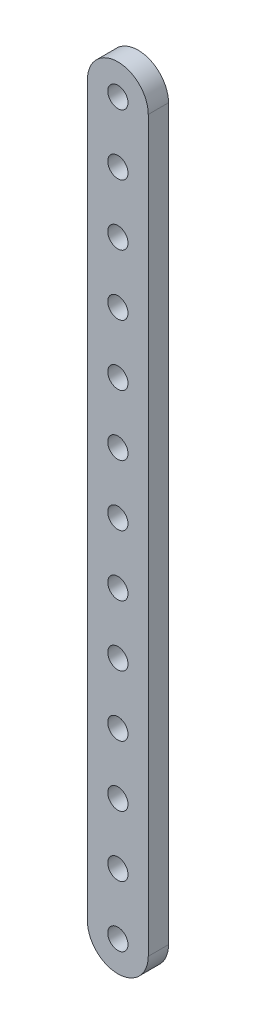
ISO-10303-21;
HEADER;
FILE_DESCRIPTION(('STEP AP214'),'2;1');
FILE_NAME('part.step','',(''),(''),'','','');
FILE_SCHEMA(('AUTOMOTIVE_DESIGN { 1 0 10303 214 1 1 1 1 }'));
ENDSEC;
DATA;
#1=APPLICATION_CONTEXT('core data for automotive mechanical design processes');
#2=APPLICATION_PROTOCOL_DEFINITION('international standard','automotive_design',2000,#1);
#3=PRODUCT_CONTEXT('',#1,'mechanical');
#4=PRODUCT('Part','Part','',(#3));
#5=PRODUCT_RELATED_PRODUCT_CATEGORY('part','',(#4));
#6=PRODUCT_DEFINITION_FORMATION('','',#4);
#7=PRODUCT_DEFINITION_CONTEXT('part definition',#1,'design');
#8=PRODUCT_DEFINITION('design','',#6,#7);
#9=PRODUCT_DEFINITION_SHAPE('','',#8);
#10=(LENGTH_UNIT() NAMED_UNIT(*) SI_UNIT(.MILLI.,.METRE.));
#11=(NAMED_UNIT(*) PLANE_ANGLE_UNIT() SI_UNIT($,.RADIAN.));
#12=(NAMED_UNIT(*) SI_UNIT($,.STERADIAN.) SOLID_ANGLE_UNIT());
#13=UNCERTAINTY_MEASURE_WITH_UNIT(LENGTH_MEASURE(1.E-05),#10,'distance_accuracy_value','');
#14=(GEOMETRIC_REPRESENTATION_CONTEXT(3) GLOBAL_UNCERTAINTY_ASSIGNED_CONTEXT((#13)) GLOBAL_UNIT_ASSIGNED_CONTEXT((#10,
#11,#12)) REPRESENTATION_CONTEXT('',''));
#15=CARTESIAN_POINT('',(0.,0.,0.));
#16=DIRECTION('',(0.,0.,1.));
#17=DIRECTION('',(1.,0.,0.));
#18=AXIS2_PLACEMENT_3D('',#15,#16,#17);
#19=CARTESIAN_POINT('',(208.7507761496,80.428489513,3.));
#20=DIRECTION('',(0.,0.,1.));
#21=DIRECTION('',(1.,0.,0.));
#22=AXIS2_PLACEMENT_3D('',#19,#20,#21);
#23=PLANE('',#22);
#24=CARTESIAN_POINT('',(208.7507761496,98.428489513,3.));
#25=DIRECTION('',(0.,0.,1.));
#26=DIRECTION('',(1.,0.,0.));
#27=AXIS2_PLACEMENT_3D('',#24,#25,#26);
#28=CIRCLE('',#27,1.5);
#29=CARTESIAN_POINT('',(210.2507761496,98.428489513,3.));
#30=VERTEX_POINT('',#29);
#31=EDGE_CURVE('E175',#30,#30,#28,.T.);
#32=ORIENTED_EDGE('',*,*,#31,.F.);
#33=EDGE_LOOP('',(#32));
#34=FACE_BOUND('',#33,.T.);
#35=CARTESIAN_POINT('',(208.7507761496,80.428489513,3.));
#36=DIRECTION('',(0.,0.,1.));
#37=DIRECTION('',(1.,0.,0.));
#38=AXIS2_PLACEMENT_3D('',#35,#36,#37);
#39=CIRCLE('',#38,1.5);
#40=CARTESIAN_POINT('',(210.2507761496,80.428489513,3.));
#41=VERTEX_POINT('',#40);
#42=EDGE_CURVE('E163',#41,#41,#39,.T.);
#43=ORIENTED_EDGE('',*,*,#42,.F.);
#44=EDGE_LOOP('',(#43));
#45=FACE_BOUND('',#44,.T.);
#46=CARTESIAN_POINT('',(208.7507761496,125.428489513,3.));
#47=DIRECTION('',(0.,0.,1.));
#48=DIRECTION('',(1.,0.,0.));
#49=AXIS2_PLACEMENT_3D('',#46,#47,#48);
#50=CIRCLE('',#49,1.5);
#51=CARTESIAN_POINT('',(210.2507761496,125.428489513,3.));
#52=VERTEX_POINT('',#51);
#53=EDGE_CURVE('E151',#52,#52,#50,.T.);
#54=ORIENTED_EDGE('',*,*,#53,.F.);
#55=EDGE_LOOP('',(#54));
#56=FACE_BOUND('',#55,.T.);
#57=CARTESIAN_POINT('',(208.7507761496,143.428489513,3.));
#58=DIRECTION('',(0.,0.,1.));
#59=DIRECTION('',(1.,0.,0.));
#60=AXIS2_PLACEMENT_3D('',#57,#58,#59);
#61=CIRCLE('',#60,1.5);
#62=CARTESIAN_POINT('',(210.2507761496,143.428489513,3.));
#63=VERTEX_POINT('',#62);
#64=EDGE_CURVE('E139',#63,#63,#61,.T.);
#65=ORIENTED_EDGE('',*,*,#64,.F.);
#66=EDGE_LOOP('',(#65));
#67=FACE_BOUND('',#66,.T.);
#68=CARTESIAN_POINT('',(208.7507761496,161.428489513,3.));
#69=DIRECTION('',(0.,0.,1.));
#70=DIRECTION('',(1.,0.,0.));
#71=AXIS2_PLACEMENT_3D('',#68,#69,#70);
#72=CIRCLE('',#71,1.5);
#73=CARTESIAN_POINT('',(210.2507761496,161.428489513,3.));
#74=VERTEX_POINT('',#73);
#75=EDGE_CURVE('E127',#74,#74,#72,.T.);
#76=ORIENTED_EDGE('',*,*,#75,.F.);
#77=EDGE_LOOP('',(#76));
#78=FACE_BOUND('',#77,.T.);
#79=CARTESIAN_POINT('',(208.7507761496,188.428489513,3.));
#80=DIRECTION('',(0.,0.,1.));
#81=DIRECTION('',(1.,0.,0.));
#82=AXIS2_PLACEMENT_3D('',#79,#80,#81);
#83=CIRCLE('',#82,1.5);
#84=CARTESIAN_POINT('',(210.2507761496,188.428489513,3.));
#85=VERTEX_POINT('',#84);
#86=EDGE_CURVE('E115',#85,#85,#83,.T.);
#87=ORIENTED_EDGE('',*,*,#86,.F.);
#88=EDGE_LOOP('',(#87));
#89=FACE_BOUND('',#88,.T.);
#90=CARTESIAN_POINT('',(208.7507761496,80.428489513,3.));
#91=DIRECTION('',(0.,0.,1.));
#92=DIRECTION('',(1.,0.,0.));
#93=AXIS2_PLACEMENT_3D('',#90,#91,#92);
#94=CIRCLE('',#93,4.5);
#95=CARTESIAN_POINT('',(204.2507761496,80.428489513,3.));
#96=VERTEX_POINT('',#95);
#97=CARTESIAN_POINT('',(213.2507761496,80.428489513,3.));
#98=VERTEX_POINT('',#97);
#99=EDGE_CURVE('E85',#96,#98,#94,.T.);
#100=ORIENTED_EDGE('',*,*,#99,.T.);
#101=DIRECTION('',(0.,1.,0.));
#102=VECTOR('',#101,1.);
#103=CARTESIAN_POINT('',(213.2507761496,80.428489513,3.));
#104=LINE('',#103,#102);
#105=CARTESIAN_POINT('',(213.2507761496,188.428489513,3.));
#106=VERTEX_POINT('',#105);
#107=EDGE_CURVE('E80',#98,#106,#104,.T.);
#108=ORIENTED_EDGE('',*,*,#107,.T.);
#109=CARTESIAN_POINT('',(208.7507761496,188.428489513,3.));
#110=DIRECTION('',(0.,0.,1.));
#111=DIRECTION('',(1.,0.,0.));
#112=AXIS2_PLACEMENT_3D('',#109,#110,#111);
#113=CIRCLE('',#112,4.5);
#114=CARTESIAN_POINT('',(204.2507761496,188.428489513,3.));
#115=VERTEX_POINT('',#114);
#116=EDGE_CURVE('E83',#106,#115,#113,.T.);
#117=ORIENTED_EDGE('',*,*,#116,.T.);
#118=DIRECTION('',(0.,-1.,0.));
#119=VECTOR('',#118,1.);
#120=CARTESIAN_POINT('',(204.2507761496,188.428489513,3.));
#121=LINE('',#120,#119);
#122=EDGE_CURVE('E50',#115,#96,#121,.T.);
#123=ORIENTED_EDGE('',*,*,#122,.T.);
#124=EDGE_LOOP('',(#100,#108,#117,#123));
#125=FACE_BOUND('',#124,.T.);
#126=CARTESIAN_POINT('',(208.7507761496,179.428489513,3.));
#127=DIRECTION('',(0.,0.,1.));
#128=DIRECTION('',(1.,0.,0.));
#129=AXIS2_PLACEMENT_3D('',#126,#127,#128);
#130=CIRCLE('',#129,1.5);
#131=CARTESIAN_POINT('',(210.2507761496,179.428489513,3.));
#132=VERTEX_POINT('',#131);
#133=EDGE_CURVE('E100',#132,#132,#130,.T.);
#134=ORIENTED_EDGE('',*,*,#133,.F.);
#135=EDGE_LOOP('',(#134));
#136=FACE_BOUND('',#135,.T.);
#137=CARTESIAN_POINT('',(208.7507761496,152.428489513,3.));
#138=DIRECTION('',(0.,0.,1.));
#139=DIRECTION('',(1.,0.,0.));
#140=AXIS2_PLACEMENT_3D('',#137,#138,#139);
#141=CIRCLE('',#140,1.5);
#142=CARTESIAN_POINT('',(210.2507761496,152.428489513,3.));
#143=VERTEX_POINT('',#142);
#144=EDGE_CURVE('E121',#143,#143,#141,.T.);
#145=ORIENTED_EDGE('',*,*,#144,.F.);
#146=EDGE_LOOP('',(#145));
#147=FACE_BOUND('',#146,.T.);
#148=CARTESIAN_POINT('',(208.7507761496,170.428489513,3.));
#149=DIRECTION('',(0.,0.,1.));
#150=DIRECTION('',(1.,0.,0.));
#151=AXIS2_PLACEMENT_3D('',#148,#149,#150);
#152=CIRCLE('',#151,1.5);
#153=CARTESIAN_POINT('',(210.2507761496,170.428489513,3.));
#154=VERTEX_POINT('',#153);
#155=EDGE_CURVE('E133',#154,#154,#152,.T.);
#156=ORIENTED_EDGE('',*,*,#155,.F.);
#157=EDGE_LOOP('',(#156));
#158=FACE_BOUND('',#157,.T.);
#159=CARTESIAN_POINT('',(208.7507761496,116.428489513,3.));
#160=DIRECTION('',(0.,0.,1.));
#161=DIRECTION('',(1.,0.,0.));
#162=AXIS2_PLACEMENT_3D('',#159,#160,#161);
#163=CIRCLE('',#162,1.5);
#164=CARTESIAN_POINT('',(210.2507761496,116.428489513,3.));
#165=VERTEX_POINT('',#164);
#166=EDGE_CURVE('E145',#165,#165,#163,.T.);
#167=ORIENTED_EDGE('',*,*,#166,.F.);
#168=EDGE_LOOP('',(#167));
#169=FACE_BOUND('',#168,.T.);
#170=CARTESIAN_POINT('',(208.7507761496,134.428489513,3.));
#171=DIRECTION('',(0.,0.,1.));
#172=DIRECTION('',(1.,0.,0.));
#173=AXIS2_PLACEMENT_3D('',#170,#171,#172);
#174=CIRCLE('',#173,1.5);
#175=CARTESIAN_POINT('',(210.2507761496,134.428489513,3.));
#176=VERTEX_POINT('',#175);
#177=EDGE_CURVE('E157',#176,#176,#174,.T.);
#178=ORIENTED_EDGE('',*,*,#177,.F.);
#179=EDGE_LOOP('',(#178));
#180=FACE_BOUND('',#179,.T.);
#181=CARTESIAN_POINT('',(208.7507761496,89.428489513,3.));
#182=DIRECTION('',(0.,0.,1.));
#183=DIRECTION('',(1.,0.,0.));
#184=AXIS2_PLACEMENT_3D('',#181,#182,#183);
#185=CIRCLE('',#184,1.5);
#186=CARTESIAN_POINT('',(210.2507761496,89.428489513,3.));
#187=VERTEX_POINT('',#186);
#188=EDGE_CURVE('E169',#187,#187,#185,.T.);
#189=ORIENTED_EDGE('',*,*,#188,.F.);
#190=EDGE_LOOP('',(#189));
#191=FACE_BOUND('',#190,.T.);
#192=CARTESIAN_POINT('',(208.7507761496,107.428489513,3.));
#193=DIRECTION('',(0.,0.,1.));
#194=DIRECTION('',(1.,0.,0.));
#195=AXIS2_PLACEMENT_3D('',#192,#193,#194);
#196=CIRCLE('',#195,1.5);
#197=CARTESIAN_POINT('',(210.2507761496,107.428489513,3.));
#198=VERTEX_POINT('',#197);
#199=EDGE_CURVE('E181',#198,#198,#196,.T.);
#200=ORIENTED_EDGE('',*,*,#199,.F.);
#201=EDGE_LOOP('',(#200));
#202=FACE_BOUND('',#201,.T.);
#203=ADVANCED_FACE('F33',(#34,#45,#56,#67,#78,#89,#125,#136,#147,#158,#169,#180,#191,#202),#23,.T.);
#204=CARTESIAN_POINT('',(208.7507761496,80.428489513,0.));
#205=DIRECTION('',(0.,0.,1.));
#206=DIRECTION('',(1.,0.,0.));
#207=AXIS2_PLACEMENT_3D('',#204,#205,#206);
#208=PLANE('',#207);
#209=CARTESIAN_POINT('',(208.7507761496,98.428489513,0.));
#210=DIRECTION('',(0.,0.,1.));
#211=DIRECTION('',(1.,0.,0.));
#212=AXIS2_PLACEMENT_3D('',#209,#210,#211);
#213=CIRCLE('',#212,1.5);
#214=CARTESIAN_POINT('',(210.2507761496,98.428489513,0.));
#215=VERTEX_POINT('',#214);
#216=EDGE_CURVE('E178',#215,#215,#213,.T.);
#217=ORIENTED_EDGE('',*,*,#216,.T.);
#218=EDGE_LOOP('',(#217));
#219=FACE_BOUND('',#218,.T.);
#220=CARTESIAN_POINT('',(208.7507761496,80.428489513,0.));
#221=DIRECTION('',(0.,0.,1.));
#222=DIRECTION('',(1.,0.,0.));
#223=AXIS2_PLACEMENT_3D('',#220,#221,#222);
#224=CIRCLE('',#223,1.5);
#225=CARTESIAN_POINT('',(210.2507761496,80.428489513,0.));
#226=VERTEX_POINT('',#225);
#227=EDGE_CURVE('E166',#226,#226,#224,.T.);
#228=ORIENTED_EDGE('',*,*,#227,.T.);
#229=EDGE_LOOP('',(#228));
#230=FACE_BOUND('',#229,.T.);
#231=CARTESIAN_POINT('',(208.7507761496,125.428489513,0.));
#232=DIRECTION('',(0.,0.,1.));
#233=DIRECTION('',(1.,0.,0.));
#234=AXIS2_PLACEMENT_3D('',#231,#232,#233);
#235=CIRCLE('',#234,1.5);
#236=CARTESIAN_POINT('',(210.2507761496,125.428489513,0.));
#237=VERTEX_POINT('',#236);
#238=EDGE_CURVE('E154',#237,#237,#235,.T.);
#239=ORIENTED_EDGE('',*,*,#238,.T.);
#240=EDGE_LOOP('',(#239));
#241=FACE_BOUND('',#240,.T.);
#242=CARTESIAN_POINT('',(208.7507761496,143.428489513,0.));
#243=DIRECTION('',(0.,0.,1.));
#244=DIRECTION('',(1.,0.,0.));
#245=AXIS2_PLACEMENT_3D('',#242,#243,#244);
#246=CIRCLE('',#245,1.5);
#247=CARTESIAN_POINT('',(210.2507761496,143.428489513,0.));
#248=VERTEX_POINT('',#247);
#249=EDGE_CURVE('E142',#248,#248,#246,.T.);
#250=ORIENTED_EDGE('',*,*,#249,.T.);
#251=EDGE_LOOP('',(#250));
#252=FACE_BOUND('',#251,.T.);
#253=CARTESIAN_POINT('',(208.7507761496,161.428489513,0.));
#254=DIRECTION('',(0.,0.,1.));
#255=DIRECTION('',(1.,0.,0.));
#256=AXIS2_PLACEMENT_3D('',#253,#254,#255);
#257=CIRCLE('',#256,1.5);
#258=CARTESIAN_POINT('',(210.2507761496,161.428489513,0.));
#259=VERTEX_POINT('',#258);
#260=EDGE_CURVE('E130',#259,#259,#257,.T.);
#261=ORIENTED_EDGE('',*,*,#260,.T.);
#262=EDGE_LOOP('',(#261));
#263=FACE_BOUND('',#262,.T.);
#264=CARTESIAN_POINT('',(208.7507761496,188.428489513,0.));
#265=DIRECTION('',(0.,0.,1.));
#266=DIRECTION('',(1.,0.,0.));
#267=AXIS2_PLACEMENT_3D('',#264,#265,#266);
#268=CIRCLE('',#267,1.5);
#269=CARTESIAN_POINT('',(210.2507761496,188.428489513,0.));
#270=VERTEX_POINT('',#269);
#271=EDGE_CURVE('E118',#270,#270,#268,.T.);
#272=ORIENTED_EDGE('',*,*,#271,.T.);
#273=EDGE_LOOP('',(#272));
#274=FACE_BOUND('',#273,.T.);
#275=CARTESIAN_POINT('',(208.7507761496,80.428489513,0.));
#276=DIRECTION('',(0.,0.,1.));
#277=DIRECTION('',(1.,0.,0.));
#278=AXIS2_PLACEMENT_3D('',#275,#276,#277);
#279=CIRCLE('',#278,4.5);
#280=CARTESIAN_POINT('',(204.2507761496,80.428489513,0.));
#281=VERTEX_POINT('',#280);
#282=CARTESIAN_POINT('',(213.2507761496,80.428489513,0.));
#283=VERTEX_POINT('',#282);
#284=EDGE_CURVE('E97',#281,#283,#279,.T.);
#285=ORIENTED_EDGE('',*,*,#284,.F.);
#286=DIRECTION('',(0.,-1.,0.));
#287=VECTOR('',#286,1.);
#288=CARTESIAN_POINT('',(204.2507761496,188.428489513,0.));
#289=LINE('',#288,#287);
#290=CARTESIAN_POINT('',(204.2507761496,188.428489513,0.));
#291=VERTEX_POINT('',#290);
#292=EDGE_CURVE('E73',#291,#281,#289,.T.);
#293=ORIENTED_EDGE('',*,*,#292,.F.);
#294=CARTESIAN_POINT('',(208.7507761496,188.428489513,0.));
#295=DIRECTION('',(0.,0.,1.));
#296=DIRECTION('',(1.,0.,0.));
#297=AXIS2_PLACEMENT_3D('',#294,#295,#296);
#298=CIRCLE('',#297,4.5);
#299=CARTESIAN_POINT('',(213.2507761496,188.428489513,0.));
#300=VERTEX_POINT('',#299);
#301=EDGE_CURVE('E67',#300,#291,#298,.T.);
#302=ORIENTED_EDGE('',*,*,#301,.F.);
#303=DIRECTION('',(0.,1.,0.));
#304=VECTOR('',#303,1.);
#305=CARTESIAN_POINT('',(213.2507761496,80.428489513,0.));
#306=LINE('',#305,#304);
#307=EDGE_CURVE('E89',#283,#300,#306,.T.);
#308=ORIENTED_EDGE('',*,*,#307,.F.);
#309=EDGE_LOOP('',(#285,#293,#302,#308));
#310=FACE_BOUND('',#309,.T.);
#311=CARTESIAN_POINT('',(208.7507761496,179.428489513,0.));
#312=DIRECTION('',(0.,0.,1.));
#313=DIRECTION('',(1.,0.,0.));
#314=AXIS2_PLACEMENT_3D('',#311,#312,#313);
#315=CIRCLE('',#314,1.5);
#316=CARTESIAN_POINT('',(210.2507761496,179.428489513,0.));
#317=VERTEX_POINT('',#316);
#318=EDGE_CURVE('E112',#317,#317,#315,.T.);
#319=ORIENTED_EDGE('',*,*,#318,.T.);
#320=EDGE_LOOP('',(#319));
#321=FACE_BOUND('',#320,.T.);
#322=CARTESIAN_POINT('',(208.7507761496,152.428489513,0.));
#323=DIRECTION('',(0.,0.,1.));
#324=DIRECTION('',(1.,0.,0.));
#325=AXIS2_PLACEMENT_3D('',#322,#323,#324);
#326=CIRCLE('',#325,1.5);
#327=CARTESIAN_POINT('',(210.2507761496,152.428489513,0.));
#328=VERTEX_POINT('',#327);
#329=EDGE_CURVE('E124',#328,#328,#326,.T.);
#330=ORIENTED_EDGE('',*,*,#329,.T.);
#331=EDGE_LOOP('',(#330));
#332=FACE_BOUND('',#331,.T.);
#333=CARTESIAN_POINT('',(208.7507761496,170.428489513,0.));
#334=DIRECTION('',(0.,0.,1.));
#335=DIRECTION('',(1.,0.,0.));
#336=AXIS2_PLACEMENT_3D('',#333,#334,#335);
#337=CIRCLE('',#336,1.5);
#338=CARTESIAN_POINT('',(210.2507761496,170.428489513,0.));
#339=VERTEX_POINT('',#338);
#340=EDGE_CURVE('E136',#339,#339,#337,.T.);
#341=ORIENTED_EDGE('',*,*,#340,.T.);
#342=EDGE_LOOP('',(#341));
#343=FACE_BOUND('',#342,.T.);
#344=CARTESIAN_POINT('',(208.7507761496,116.428489513,0.));
#345=DIRECTION('',(0.,0.,1.));
#346=DIRECTION('',(1.,0.,0.));
#347=AXIS2_PLACEMENT_3D('',#344,#345,#346);
#348=CIRCLE('',#347,1.5);
#349=CARTESIAN_POINT('',(210.2507761496,116.428489513,0.));
#350=VERTEX_POINT('',#349);
#351=EDGE_CURVE('E148',#350,#350,#348,.T.);
#352=ORIENTED_EDGE('',*,*,#351,.T.);
#353=EDGE_LOOP('',(#352));
#354=FACE_BOUND('',#353,.T.);
#355=CARTESIAN_POINT('',(208.7507761496,134.428489513,0.));
#356=DIRECTION('',(0.,0.,1.));
#357=DIRECTION('',(1.,0.,0.));
#358=AXIS2_PLACEMENT_3D('',#355,#356,#357);
#359=CIRCLE('',#358,1.5);
#360=CARTESIAN_POINT('',(210.2507761496,134.428489513,0.));
#361=VERTEX_POINT('',#360);
#362=EDGE_CURVE('E160',#361,#361,#359,.T.);
#363=ORIENTED_EDGE('',*,*,#362,.T.);
#364=EDGE_LOOP('',(#363));
#365=FACE_BOUND('',#364,.T.);
#366=CARTESIAN_POINT('',(208.7507761496,89.428489513,0.));
#367=DIRECTION('',(0.,0.,1.));
#368=DIRECTION('',(1.,0.,0.));
#369=AXIS2_PLACEMENT_3D('',#366,#367,#368);
#370=CIRCLE('',#369,1.5);
#371=CARTESIAN_POINT('',(210.2507761496,89.428489513,0.));
#372=VERTEX_POINT('',#371);
#373=EDGE_CURVE('E172',#372,#372,#370,.T.);
#374=ORIENTED_EDGE('',*,*,#373,.T.);
#375=EDGE_LOOP('',(#374));
#376=FACE_BOUND('',#375,.T.);
#377=CARTESIAN_POINT('',(208.7507761496,107.428489513,0.));
#378=DIRECTION('',(0.,0.,1.));
#379=DIRECTION('',(1.,0.,0.));
#380=AXIS2_PLACEMENT_3D('',#377,#378,#379);
#381=CIRCLE('',#380,1.5);
#382=CARTESIAN_POINT('',(210.2507761496,107.428489513,0.));
#383=VERTEX_POINT('',#382);
#384=EDGE_CURVE('E184',#383,#383,#381,.T.);
#385=ORIENTED_EDGE('',*,*,#384,.T.);
#386=EDGE_LOOP('',(#385));
#387=FACE_BOUND('',#386,.T.);
#388=ADVANCED_FACE('F108',(#219,#230,#241,#252,#263,#274,#310,#321,#332,#343,#354,#365,#376,
#387),#208,.F.);
#389=CARTESIAN_POINT('',(208.7507761496,80.428489513,3.));
#390=DIRECTION('',(0.,0.,-1.));
#391=DIRECTION('',(-1.,0.,0.));
#392=AXIS2_PLACEMENT_3D('',#389,#390,#391);
#393=CYLINDRICAL_SURFACE('',#392,4.5);
#394=ORIENTED_EDGE('',*,*,#284,.T.);
#395=DIRECTION('',(0.,0.,-1.));
#396=VECTOR('',#395,1.);
#397=CARTESIAN_POINT('',(213.2507761496,80.428489513,3.));
#398=LINE('',#397,#396);
#399=EDGE_CURVE('E11',#98,#283,#398,.T.);
#400=ORIENTED_EDGE('',*,*,#399,.F.);
#401=ORIENTED_EDGE('',*,*,#99,.F.);
#402=DIRECTION('',(0.,0.,-1.));
#403=VECTOR('',#402,1.);
#404=CARTESIAN_POINT('',(204.2507761496,80.428489513,3.));
#405=LINE('',#404,#403);
#406=EDGE_CURVE('E93',#96,#281,#405,.T.);
#407=ORIENTED_EDGE('',*,*,#406,.T.);
#408=EDGE_LOOP('',(#394,#400,#401,#407));
#409=FACE_BOUND('',#408,.T.);
#410=ADVANCED_FACE('F35',(#409),#393,.T.);
#411=CARTESIAN_POINT('',(213.2507761496,80.428489513,3.));
#412=DIRECTION('',(-1.,0.,0.));
#413=DIRECTION('',(0.,0.,1.));
#414=AXIS2_PLACEMENT_3D('',#411,#412,#413);
#415=PLANE('',#414);
#416=ORIENTED_EDGE('',*,*,#307,.T.);
#417=DIRECTION('',(0.,0.,-1.));
#418=VECTOR('',#417,1.);
#419=CARTESIAN_POINT('',(213.2507761496,188.428489513,3.));
#420=LINE('',#419,#418);
#421=EDGE_CURVE('E42',#106,#300,#420,.T.);
#422=ORIENTED_EDGE('',*,*,#421,.F.);
#423=ORIENTED_EDGE('',*,*,#107,.F.);
#424=ORIENTED_EDGE('',*,*,#399,.T.);
#425=EDGE_LOOP('',(#416,#422,#423,#424));
#426=FACE_BOUND('',#425,.T.);
#427=ADVANCED_FACE('F88',(#426),#415,.F.);
#428=CARTESIAN_POINT('',(208.7507761496,188.428489513,3.));
#429=DIRECTION('',(0.,0.,-1.));
#430=DIRECTION('',(-1.,0.,0.));
#431=AXIS2_PLACEMENT_3D('',#428,#429,#430);
#432=CYLINDRICAL_SURFACE('',#431,4.5);
#433=ORIENTED_EDGE('',*,*,#301,.T.);
#434=DIRECTION('',(0.,0.,-1.));
#435=VECTOR('',#434,1.);
#436=CARTESIAN_POINT('',(204.2507761496,188.428489513,3.));
#437=LINE('',#436,#435);
#438=EDGE_CURVE('E90',#115,#291,#437,.T.);
#439=ORIENTED_EDGE('',*,*,#438,.F.);
#440=ORIENTED_EDGE('',*,*,#116,.F.);
#441=ORIENTED_EDGE('',*,*,#421,.T.);
#442=EDGE_LOOP('',(#433,#439,#440,#441));
#443=FACE_BOUND('',#442,.T.);
#444=ADVANCED_FACE('F91',(#443),#432,.T.);
#445=CARTESIAN_POINT('',(204.2507761496,188.428489513,3.));
#446=DIRECTION('',(1.,0.,0.));
#447=DIRECTION('',(0.,0.,-1.));
#448=AXIS2_PLACEMENT_3D('',#445,#446,#447);
#449=PLANE('',#448);
#450=ORIENTED_EDGE('',*,*,#292,.T.);
#451=ORIENTED_EDGE('',*,*,#406,.F.);
#452=ORIENTED_EDGE('',*,*,#122,.F.);
#453=ORIENTED_EDGE('',*,*,#438,.T.);
#454=EDGE_LOOP('',(#450,#451,#452,#453));
#455=FACE_BOUND('',#454,.T.);
#456=ADVANCED_FACE('F105',(#455),#449,.F.);
#457=CARTESIAN_POINT('',(208.7507761496,179.428489513,3.));
#458=DIRECTION('',(0.,0.,-1.));
#459=DIRECTION('',(-1.,0.,0.));
#460=AXIS2_PLACEMENT_3D('',#457,#458,#459);
#461=CYLINDRICAL_SURFACE('',#460,1.5);
#462=ORIENTED_EDGE('',*,*,#133,.T.);
#463=EDGE_LOOP('',(#462));
#464=FACE_BOUND('',#463,.T.);
#465=ORIENTED_EDGE('',*,*,#318,.F.);
#466=EDGE_LOOP('',(#465));
#467=FACE_BOUND('',#466,.T.);
#468=ADVANCED_FACE('F204',(#464,#467),#461,.F.);
#469=CARTESIAN_POINT('',(208.7507761496,188.428489513,3.));
#470=DIRECTION('',(0.,0.,-1.));
#471=DIRECTION('',(-1.,0.,0.));
#472=AXIS2_PLACEMENT_3D('',#469,#470,#471);
#473=CYLINDRICAL_SURFACE('',#472,1.5);
#474=ORIENTED_EDGE('',*,*,#86,.T.);
#475=EDGE_LOOP('',(#474));
#476=FACE_BOUND('',#475,.T.);
#477=ORIENTED_EDGE('',*,*,#271,.F.);
#478=EDGE_LOOP('',(#477));
#479=FACE_BOUND('',#478,.T.);
#480=ADVANCED_FACE('F250',(#476,#479),#473,.F.);
#481=CARTESIAN_POINT('',(208.7507761496,152.428489513,3.));
#482=DIRECTION('',(0.,0.,-1.));
#483=DIRECTION('',(-1.,0.,0.));
#484=AXIS2_PLACEMENT_3D('',#481,#482,#483);
#485=CYLINDRICAL_SURFACE('',#484,1.5);
#486=ORIENTED_EDGE('',*,*,#144,.T.);
#487=EDGE_LOOP('',(#486));
#488=FACE_BOUND('',#487,.T.);
#489=ORIENTED_EDGE('',*,*,#329,.F.);
#490=EDGE_LOOP('',(#489));
#491=FACE_BOUND('',#490,.T.);
#492=ADVANCED_FACE('F258',(#488,#491),#485,.F.);
#493=CARTESIAN_POINT('',(208.7507761496,161.428489513,3.));
#494=DIRECTION('',(0.,0.,-1.));
#495=DIRECTION('',(-1.,0.,0.));
#496=AXIS2_PLACEMENT_3D('',#493,#494,#495);
#497=CYLINDRICAL_SURFACE('',#496,1.5);
#498=ORIENTED_EDGE('',*,*,#75,.T.);
#499=EDGE_LOOP('',(#498));
#500=FACE_BOUND('',#499,.T.);
#501=ORIENTED_EDGE('',*,*,#260,.F.);
#502=EDGE_LOOP('',(#501));
#503=FACE_BOUND('',#502,.T.);
#504=ADVANCED_FACE('F266',(#500,#503),#497,.F.);
#505=CARTESIAN_POINT('',(208.7507761496,170.428489513,3.));
#506=DIRECTION('',(0.,0.,-1.));
#507=DIRECTION('',(-1.,0.,0.));
#508=AXIS2_PLACEMENT_3D('',#505,#506,#507);
#509=CYLINDRICAL_SURFACE('',#508,1.5);
#510=ORIENTED_EDGE('',*,*,#155,.T.);
#511=EDGE_LOOP('',(#510));
#512=FACE_BOUND('',#511,.T.);
#513=ORIENTED_EDGE('',*,*,#340,.F.);
#514=EDGE_LOOP('',(#513));
#515=FACE_BOUND('',#514,.T.);
#516=ADVANCED_FACE('F275',(#512,#515),#509,.F.);
#517=CARTESIAN_POINT('',(208.7507761496,143.428489513,3.));
#518=DIRECTION('',(0.,0.,-1.));
#519=DIRECTION('',(-1.,0.,0.));
#520=AXIS2_PLACEMENT_3D('',#517,#518,#519);
#521=CYLINDRICAL_SURFACE('',#520,1.5);
#522=ORIENTED_EDGE('',*,*,#64,.T.);
#523=EDGE_LOOP('',(#522));
#524=FACE_BOUND('',#523,.T.);
#525=ORIENTED_EDGE('',*,*,#249,.F.);
#526=EDGE_LOOP('',(#525));
#527=FACE_BOUND('',#526,.T.);
#528=ADVANCED_FACE('F284',(#524,#527),#521,.F.);
#529=CARTESIAN_POINT('',(208.7507761496,116.428489513,3.));
#530=DIRECTION('',(0.,0.,-1.));
#531=DIRECTION('',(-1.,0.,0.));
#532=AXIS2_PLACEMENT_3D('',#529,#530,#531);
#533=CYLINDRICAL_SURFACE('',#532,1.5);
#534=ORIENTED_EDGE('',*,*,#166,.T.);
#535=EDGE_LOOP('',(#534));
#536=FACE_BOUND('',#535,.T.);
#537=ORIENTED_EDGE('',*,*,#351,.F.);
#538=EDGE_LOOP('',(#537));
#539=FACE_BOUND('',#538,.T.);
#540=ADVANCED_FACE('F293',(#536,#539),#533,.F.);
#541=CARTESIAN_POINT('',(208.7507761496,125.428489513,3.));
#542=DIRECTION('',(0.,0.,-1.));
#543=DIRECTION('',(-1.,0.,0.));
#544=AXIS2_PLACEMENT_3D('',#541,#542,#543);
#545=CYLINDRICAL_SURFACE('',#544,1.5);
#546=ORIENTED_EDGE('',*,*,#53,.T.);
#547=EDGE_LOOP('',(#546));
#548=FACE_BOUND('',#547,.T.);
#549=ORIENTED_EDGE('',*,*,#238,.F.);
#550=EDGE_LOOP('',(#549));
#551=FACE_BOUND('',#550,.T.);
#552=ADVANCED_FACE('F302',(#548,#551),#545,.F.);
#553=CARTESIAN_POINT('',(208.7507761496,134.428489513,3.));
#554=DIRECTION('',(0.,0.,-1.));
#555=DIRECTION('',(-1.,0.,0.));
#556=AXIS2_PLACEMENT_3D('',#553,#554,#555);
#557=CYLINDRICAL_SURFACE('',#556,1.5);
#558=ORIENTED_EDGE('',*,*,#177,.T.);
#559=EDGE_LOOP('',(#558));
#560=FACE_BOUND('',#559,.T.);
#561=ORIENTED_EDGE('',*,*,#362,.F.);
#562=EDGE_LOOP('',(#561));
#563=FACE_BOUND('',#562,.T.);
#564=ADVANCED_FACE('F311',(#560,#563),#557,.F.);
#565=CARTESIAN_POINT('',(208.7507761496,80.428489513,3.));
#566=DIRECTION('',(0.,0.,-1.));
#567=DIRECTION('',(-1.,0.,0.));
#568=AXIS2_PLACEMENT_3D('',#565,#566,#567);
#569=CYLINDRICAL_SURFACE('',#568,1.5);
#570=ORIENTED_EDGE('',*,*,#42,.T.);
#571=EDGE_LOOP('',(#570));
#572=FACE_BOUND('',#571,.T.);
#573=ORIENTED_EDGE('',*,*,#227,.F.);
#574=EDGE_LOOP('',(#573));
#575=FACE_BOUND('',#574,.T.);
#576=ADVANCED_FACE('F320',(#572,#575),#569,.F.);
#577=CARTESIAN_POINT('',(208.7507761496,89.428489513,3.));
#578=DIRECTION('',(0.,0.,-1.));
#579=DIRECTION('',(-1.,0.,0.));
#580=AXIS2_PLACEMENT_3D('',#577,#578,#579);
#581=CYLINDRICAL_SURFACE('',#580,1.5);
#582=ORIENTED_EDGE('',*,*,#188,.T.);
#583=EDGE_LOOP('',(#582));
#584=FACE_BOUND('',#583,.T.);
#585=ORIENTED_EDGE('',*,*,#373,.F.);
#586=EDGE_LOOP('',(#585));
#587=FACE_BOUND('',#586,.T.);
#588=ADVANCED_FACE('F329',(#584,#587),#581,.F.);
#589=CARTESIAN_POINT('',(208.7507761496,98.428489513,3.));
#590=DIRECTION('',(0.,0.,-1.));
#591=DIRECTION('',(-1.,0.,0.));
#592=AXIS2_PLACEMENT_3D('',#589,#590,#591);
#593=CYLINDRICAL_SURFACE('',#592,1.5);
#594=ORIENTED_EDGE('',*,*,#31,.T.);
#595=EDGE_LOOP('',(#594));
#596=FACE_BOUND('',#595,.T.);
#597=ORIENTED_EDGE('',*,*,#216,.F.);
#598=EDGE_LOOP('',(#597));
#599=FACE_BOUND('',#598,.T.);
#600=ADVANCED_FACE('F338',(#596,#599),#593,.F.);
#601=CARTESIAN_POINT('',(208.7507761496,107.428489513,3.));
#602=DIRECTION('',(0.,0.,-1.));
#603=DIRECTION('',(-1.,0.,0.));
#604=AXIS2_PLACEMENT_3D('',#601,#602,#603);
#605=CYLINDRICAL_SURFACE('',#604,1.5);
#606=ORIENTED_EDGE('',*,*,#199,.T.);
#607=EDGE_LOOP('',(#606));
#608=FACE_BOUND('',#607,.T.);
#609=ORIENTED_EDGE('',*,*,#384,.F.);
#610=EDGE_LOOP('',(#609));
#611=FACE_BOUND('',#610,.T.);
#612=ADVANCED_FACE('F190',(#608,#611),#605,.F.);
#613=CLOSED_SHELL('',(#203,#388,#410,#427,#444,#456,#468,#480,#492,#504,#516,#528,#540,#552,
#564,#576,#588,#600,#612));
#614=MANIFOLD_SOLID_BREP('B2',#613);
#615=ADVANCED_BREP_SHAPE_REPRESENTATION('',(#18,#614),#14);
#616=SHAPE_DEFINITION_REPRESENTATION(#9,#615);
ENDSEC;
END-ISO-10303-21;
